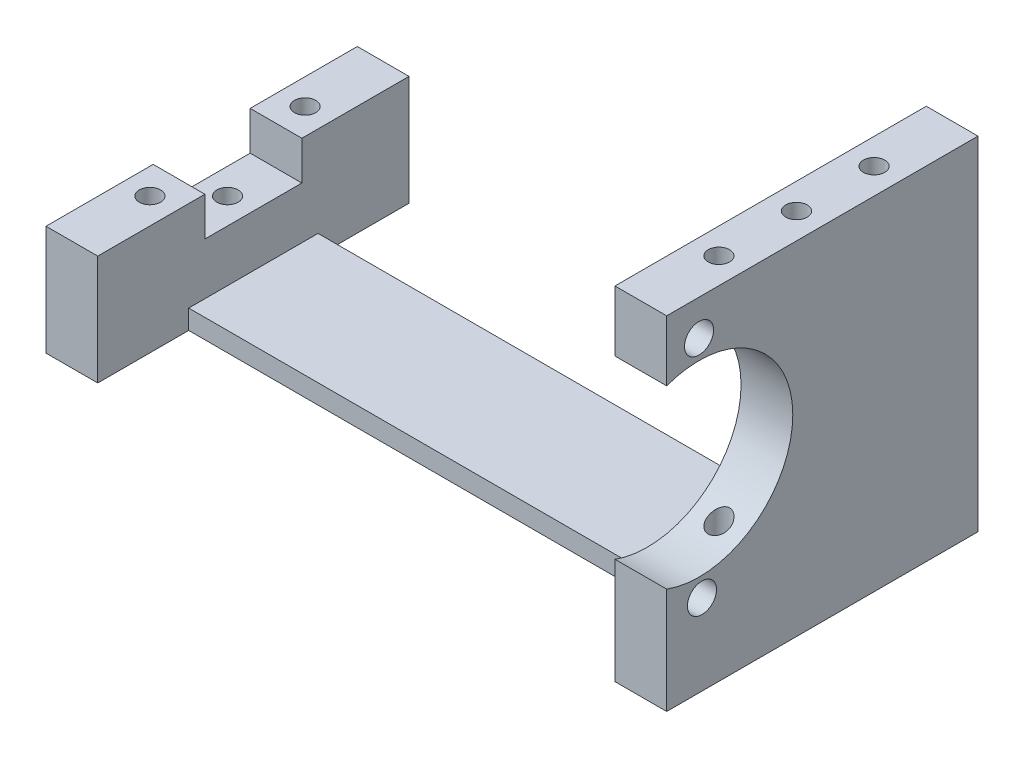
ISO-10303-21;
HEADER;
FILE_DESCRIPTION(('STEP AP214'),'2;1');
FILE_NAME('part.step','',(''),(''),'','','');
FILE_SCHEMA(('AUTOMOTIVE_DESIGN { 1 0 10303 214 1 1 1 1 }'));
ENDSEC;
DATA;
#1=APPLICATION_CONTEXT('core data for automotive mechanical design processes');
#2=APPLICATION_PROTOCOL_DEFINITION('international standard','automotive_design',2000,#1);
#3=PRODUCT_CONTEXT('',#1,'mechanical');
#4=PRODUCT('Part','Part','',(#3));
#5=PRODUCT_RELATED_PRODUCT_CATEGORY('part','',(#4));
#6=PRODUCT_DEFINITION_FORMATION('','',#4);
#7=PRODUCT_DEFINITION_CONTEXT('part definition',#1,'design');
#8=PRODUCT_DEFINITION('design','',#6,#7);
#9=PRODUCT_DEFINITION_SHAPE('','',#8);
#10=(LENGTH_UNIT() NAMED_UNIT(*) SI_UNIT(.MILLI.,.METRE.));
#11=(NAMED_UNIT(*) PLANE_ANGLE_UNIT() SI_UNIT($,.RADIAN.));
#12=(NAMED_UNIT(*) SI_UNIT($,.STERADIAN.) SOLID_ANGLE_UNIT());
#13=UNCERTAINTY_MEASURE_WITH_UNIT(LENGTH_MEASURE(1.E-05),#10,'distance_accuracy_value','');
#14=(GEOMETRIC_REPRESENTATION_CONTEXT(3) GLOBAL_UNCERTAINTY_ASSIGNED_CONTEXT((#13)) GLOBAL_UNIT_ASSIGNED_CONTEXT((#10,
#11,#12)) REPRESENTATION_CONTEXT('',''));
#15=CARTESIAN_POINT('',(0.,0.,0.));
#16=DIRECTION('',(0.,0.,1.));
#17=DIRECTION('',(1.,0.,0.));
#18=AXIS2_PLACEMENT_3D('',#15,#16,#17);
#19=CARTESIAN_POINT('',(-33.,17.,-24.0737419650709));
#20=DIRECTION('',(0.,-1.,0.));
#21=DIRECTION('',(0.,0.,-1.));
#22=AXIS2_PLACEMENT_3D('',#19,#20,#21);
#23=PLANE('',#22);
#24=CARTESIAN_POINT('',(-44.,17.,12.));
#25=DIRECTION('',(0.,-1.,0.));
#26=DIRECTION('',(0.,0.,-1.));
#27=AXIS2_PLACEMENT_3D('',#24,#25,#26);
#28=CIRCLE('',#27,1.65);
#29=CARTESIAN_POINT('',(-44.,17.,10.35));
#30=VERTEX_POINT('',#29);
#31=EDGE_CURVE('E216',#30,#30,#28,.T.);
#32=ORIENTED_EDGE('',*,*,#31,.T.);
#33=EDGE_LOOP('',(#32));
#34=FACE_BOUND('',#33,.T.);
#35=DIRECTION('',(0.,0.,1.));
#36=VECTOR('',#35,1.);
#37=CARTESIAN_POINT('',(-40.,17.,24.0737419650709));
#38=LINE('',#37,#36);
#39=CARTESIAN_POINT('',(-40.,17.,7.5));
#40=VERTEX_POINT('',#39);
#41=CARTESIAN_POINT('',(-40.,17.,24.0737419650709));
#42=VERTEX_POINT('',#41);
#43=EDGE_CURVE('E220',#40,#42,#38,.T.);
#44=ORIENTED_EDGE('',*,*,#43,.F.);
#45=DIRECTION('',(1.,0.,0.));
#46=VECTOR('',#45,1.);
#47=CARTESIAN_POINT('',(-48.,17.,7.5));
#48=LINE('',#47,#46);
#49=CARTESIAN_POINT('',(-48.,17.,7.5));
#50=VERTEX_POINT('',#49);
#51=EDGE_CURVE('E191',#50,#40,#48,.T.);
#52=ORIENTED_EDGE('',*,*,#51,.F.);
#53=DIRECTION('',(0.,0.,1.));
#54=VECTOR('',#53,1.);
#55=CARTESIAN_POINT('',(-48.,17.,-24.0737419650709));
#56=LINE('',#55,#54);
#57=CARTESIAN_POINT('',(-48.,17.,24.0737419650709));
#58=VERTEX_POINT('',#57);
#59=EDGE_CURVE('E71',#50,#58,#56,.T.);
#60=ORIENTED_EDGE('',*,*,#59,.T.);
#61=DIRECTION('',(-1.,0.,0.));
#62=VECTOR('',#61,1.);
#63=CARTESIAN_POINT('',(-33.,17.,24.0737419650709));
#64=LINE('',#63,#62);
#65=EDGE_CURVE('E210',#42,#58,#64,.T.);
#66=ORIENTED_EDGE('',*,*,#65,.F.);
#67=EDGE_LOOP('',(#44,#52,#60,#66));
#68=FACE_BOUND('',#67,.T.);
#69=ADVANCED_FACE('F45',(#34,#68),#23,.F.);
#70=CARTESIAN_POINT('',(48.,53.,24.0737419650709));
#71=DIRECTION('',(0.,0.,-1.));
#72=DIRECTION('',(-1.,0.,0.));
#73=AXIS2_PLACEMENT_3D('',#70,#71,#72);
#74=PLANE('',#73);
#75=DIRECTION('',(0.,-1.,0.));
#76=VECTOR('',#75,1.);
#77=CARTESIAN_POINT('',(40.,53.,24.0737419650709));
#78=LINE('',#77,#76);
#79=CARTESIAN_POINT('',(40.,53.,24.0737419650709));
#80=VERTEX_POINT('',#79);
#81=CARTESIAN_POINT('',(40.,43.6106575888162,24.0737419650709));
#82=VERTEX_POINT('',#81);
#83=EDGE_CURVE('E265',#80,#82,#78,.T.);
#84=ORIENTED_EDGE('',*,*,#83,.T.);
#85=DIRECTION('',(1.,0.,0.));
#86=VECTOR('',#85,1.);
#87=CARTESIAN_POINT('',(28.,43.6106575888162,24.0737419650709));
#88=LINE('',#87,#86);
#89=CARTESIAN_POINT('',(48.,43.6106575888162,24.0737419650709));
#90=VERTEX_POINT('',#89);
#91=EDGE_CURVE('E244',#82,#90,#88,.T.);
#92=ORIENTED_EDGE('',*,*,#91,.T.);
#93=DIRECTION('',(0.,-1.,0.));
#94=VECTOR('',#93,1.);
#95=CARTESIAN_POINT('',(48.,53.,24.0737419650709));
#96=LINE('',#95,#94);
#97=CARTESIAN_POINT('',(48.,53.,24.0737419650709));
#98=VERTEX_POINT('',#97);
#99=EDGE_CURVE('E270',#98,#90,#96,.T.);
#100=ORIENTED_EDGE('',*,*,#99,.F.);
#101=DIRECTION('',(1.,0.,0.));
#102=VECTOR('',#101,1.);
#103=CARTESIAN_POINT('',(48.,53.,24.0737419650709));
#104=LINE('',#103,#102);
#105=EDGE_CURVE('E274',#80,#98,#104,.T.);
#106=ORIENTED_EDGE('',*,*,#105,.F.);
#107=EDGE_LOOP('',(#84,#92,#100,#106));
#108=FACE_BOUND('',#107,.T.);
#109=ADVANCED_FACE('F448',(#108),#74,.F.);
#110=CARTESIAN_POINT('',(44.,53.,12.));
#111=DIRECTION('',(0.,-1.,0.));
#112=DIRECTION('',(0.,0.,-1.));
#113=AXIS2_PLACEMENT_3D('',#110,#111,#112);
#114=CYLINDRICAL_SURFACE('',#113,1.65);
#115=CARTESIAN_POINT('',(44.,41.5821555043464,10.35));
#116=CARTESIAN_POINT('',(43.9199288509002,41.5821591037592,10.3500039617206));
#117=CARTESIAN_POINT('',(43.8398245615708,41.5865818513109,10.3558672053447));
#118=CARTESIAN_POINT('',(43.6821931853622,41.6038995568564,10.378932496376));
#119=CARTESIAN_POINT('',(43.6046682651438,41.6168014575037,10.3961438355382));
#120=CARTESIAN_POINT('',(43.4547621394242,41.6499771597757,10.4407360356112));
#121=CARTESIAN_POINT('',(43.3823569729022,41.6702134690484,10.4680651908158));
#122=CARTESIAN_POINT('',(43.2436848216434,41.7167700606641,10.5315616901544));
#123=CARTESIAN_POINT('',(43.1774193393808,41.7430918267318,10.5677311898188));
#124=CARTESIAN_POINT('',(43.0466313563389,41.8029009506185,10.6508945479393));
#125=CARTESIAN_POINT('',(42.9827161555722,41.836803057512,10.6985399610094));
#126=CARTESIAN_POINT('',(42.8636468445302,41.9087012724993,10.8010905303718));
#127=CARTESIAN_POINT('',(42.8084968133335,41.9466992729897,10.8559990450678));
#128=CARTESIAN_POINT('',(42.6974525985209,42.0331557406787,10.9829984187664));
#129=CARTESIAN_POINT('',(42.6434765781885,42.0822161508543,11.0563587120478));
#130=CARTESIAN_POINT('',(42.5487391332816,42.1826187055074,11.209759111189));
#131=CARTESIAN_POINT('',(42.5079872293476,42.2339624637659,11.289803977677));
#132=CARTESIAN_POINT('',(42.4349427737334,42.3452967766474,11.4674160691214));
#133=CARTESIAN_POINT('',(42.4048464984389,42.4054256913103,11.565807340113));
#134=CARTESIAN_POINT('',(42.3633177867184,42.524943694102,11.7669311545793));
#135=CARTESIAN_POINT('',(42.3518931036914,42.5843324647321,11.8696654833572));
#136=CARTESIAN_POINT('',(42.3484701676112,42.7031283021795,12.0811867829405));
#137=CARTESIAN_POINT('',(42.3573001531811,42.7624332750226,12.1900477155448));
#138=CARTESIAN_POINT('',(42.3969950559538,42.8766282533895,12.4061069826035));
#139=CARTESIAN_POINT('',(42.4278522803289,42.9315197928232,12.5133058841576));
#140=CARTESIAN_POINT('',(42.5091057602564,43.0316349606433,12.7146325684817));
#141=CARTESIAN_POINT('',(42.5580220444466,43.0772629820503,12.8091529372128));
#142=CARTESIAN_POINT('',(42.674891143368,43.161890525777,12.9889656966792));
#143=CARTESIAN_POINT('',(42.7428277285592,43.200895653859,13.0742658691397));
#144=CARTESIAN_POINT('',(42.887417354187,43.2671390825486,13.2223436406445));
#145=CARTESIAN_POINT('',(42.9621952826798,43.2952117164162,13.2865800652606));
#146=CARTESIAN_POINT('',(43.1235115563741,43.3446234032587,13.4014455521741));
#147=CARTESIAN_POINT('',(43.2100420730979,43.3659669073835,13.4520836061506));
#148=CARTESIAN_POINT('',(43.3833563760174,43.3997568471184,13.5331402939909));
#149=CARTESIAN_POINT('',(43.469328525804,43.4128577969983,13.5650269617582));
#150=CARTESIAN_POINT('',(43.6460309717697,43.4329442518195,13.6141885372001));
#151=CARTESIAN_POINT('',(43.7367594903427,43.4399320244215,13.6314688629631));
#152=CARTESIAN_POINT('',(43.9152012615458,43.4474729296546,13.6501301332032));
#153=CARTESIAN_POINT('',(44.0028187453818,43.4483480907855,13.6523067393003));
#154=CARTESIAN_POINT('',(44.177164283298,43.4445042401245,13.6427814401379));
#155=CARTESIAN_POINT('',(44.2638924586303,43.4397860014702,13.6310814529455));
#156=CARTESIAN_POINT('',(44.4328120975353,43.4249272801768,13.5945353955563));
#157=CARTESIAN_POINT('',(44.515048735841,43.4148601918147,13.5698673144668));
#158=CARTESIAN_POINT('',(44.6740145950646,43.389502836156,13.508464765609));
#159=CARTESIAN_POINT('',(44.750743595424,43.3742123598249,13.4717298149396));
#160=CARTESIAN_POINT('',(44.8983854040077,43.3382621325459,13.3866572926753));
#161=CARTESIAN_POINT('',(44.9691369510929,43.3174936254812,13.3380864270719));
#162=CARTESIAN_POINT('',(45.1013531857602,43.2711058853598,13.2315576329533));
#163=CARTESIAN_POINT('',(45.162816103598,43.2454857300179,13.1735979199468));
#164=CARTESIAN_POINT('',(45.2784813608872,43.1882845041474,13.0467822513979));
#165=CARTESIAN_POINT('',(45.3320901051967,43.1564512292803,12.9774996697509));
#166=CARTESIAN_POINT('',(45.4269813052059,43.0884759375528,12.8328939222301));
#167=CARTESIAN_POINT('',(45.4682597271223,43.0523325160553,12.7575687897766));
#168=CARTESIAN_POINT('',(45.5412561630048,42.973089573905,12.5962659732721));
#169=CARTESIAN_POINT('',(45.5718254004219,42.9296582623291,12.5099323303297));
#170=CARTESIAN_POINT('',(45.6181459188124,42.8394091290781,12.3351019836301));
#171=CARTESIAN_POINT('',(45.6338907038217,42.7925898324808,12.2466043490382));
#172=CARTESIAN_POINT('',(45.6518319006975,42.6914261743578,12.0601773554621));
#173=CARTESIAN_POINT('',(45.6524192398346,42.636809656593,11.9622404078026));
#174=CARTESIAN_POINT('',(45.6365939094891,42.5259267293846,11.7687010245985));
#175=CARTESIAN_POINT('',(45.6201740223053,42.469659629301,11.6730995978577));
#176=CARTESIAN_POINT('',(45.568801243886,42.3519179130047,11.4780721884206));
#177=CARTESIAN_POINT('',(45.5323413446849,42.2904217487518,11.3790526957922));
#178=CARTESIAN_POINT('',(45.4406653293609,42.1691995379669,11.18873526345));
#179=CARTESIAN_POINT('',(45.3854316091819,42.1094752102312,11.0974446717867));
#180=CARTESIAN_POINT('',(45.2563233201627,41.994047260416,10.92489724634));
#181=CARTESIAN_POINT('',(45.1823313176925,41.9383719224782,10.8437086143974));
#182=CARTESIAN_POINT('',(45.0166126371388,41.83495173611,10.6956724055473));
#183=CARTESIAN_POINT('',(44.9249292716247,41.7871880383275,10.6287906285736));
#184=CARTESIAN_POINT('',(44.7579614457744,41.7173621308838,10.5323274987627));
#185=CARTESIAN_POINT('',(44.6869649250694,41.6919838398751,10.4976785249755));
#186=CARTESIAN_POINT('',(44.5388879671805,41.648311315065,10.4384538570868));
#187=CARTESIAN_POINT('',(44.4618182882165,41.6300048790762,10.4138608075846));
#188=CARTESIAN_POINT('',(44.3206492995395,41.6048547686074,10.3801991606782));
#189=CARTESIAN_POINT('',(44.2573590957031,41.5963866465049,10.3689211153159));
#190=CARTESIAN_POINT('',(44.1293865349191,41.5850353784308,10.3538196918406));
#191=CARTESIAN_POINT('',(44.064704087698,41.5821525957242,10.3499967986032));
#192=CARTESIAN_POINT('',(44.,41.5821555043464,10.35));
#193=B_SPLINE_CURVE_WITH_KNOTS('',3,(#115,#116,#117,#118,#119,#120,#121,#122,#123,#124,#125,
#126,#127,#128,#129,#130,#131,#132,#133,#134,#135,#136,#137,#138,#139,#140,#141,#142,#143,#144,
#145,#146,#147,#148,#149,#150,#151,#152,#153,#154,#155,#156,#157,#158,#159,#160,#161,#162,#163,
#164,#165,#166,#167,#168,#169,#170,#171,#172,#173,#174,#175,#176,#177,#178,#179,#180,#181,#182,
#183,#184,#185,#186,#187,#188,#189,#190,#191,#192),.UNSPECIFIED.,.T.,.F.,(4,2,2,2,2,2,2,2,2,2,2,
2,2,2,2,2,2,2,2,2,2,2,2,2,2,2,2,2,2,2,2,2,2,2,2,2,2,2,4),(0.,0.239948002160773,
0.480092716747698,0.719026774112203,0.95801914869586,1.21696256397352,1.47602613404552,
1.78518347305687,2.09456289716383,2.45050546298702,2.80659579682894,3.17750522099601,
3.54828517150555,3.8937172840234,4.23885554172016,4.54466897026626,4.85027968444335,
5.12673611324901,5.4030899480189,5.66476687403392,5.92640763444414,6.18454764277121,
6.44269798279803,6.70641963968612,6.97019147976925,7.24862721848503,7.52715394610395,
7.82998871635141,8.13295612485416,8.46796695626159,8.80312002127732,9.16783639988999,
9.53289571783669,9.90029944781493,10.2668148460786,10.5147786116641,10.7623125945601,
10.9561977464281,11.150095507973),.UNSPECIFIED.);
#194=CARTESIAN_POINT('',(44.,41.5821555043464,10.35));
#195=VERTEX_POINT('',#194);
#196=EDGE_CURVE('E240',#195,#195,#193,.T.);
#197=ORIENTED_EDGE('',*,*,#196,.F.);
#198=EDGE_LOOP('',(#197));
#199=FACE_BOUND('',#198,.T.);
#200=CARTESIAN_POINT('',(44.,53.,12.));
#201=DIRECTION('',(0.,1.,0.));
#202=DIRECTION('',(0.,0.,-1.));
#203=AXIS2_PLACEMENT_3D('',#200,#201,#202);
#204=CIRCLE('',#203,1.65);
#205=CARTESIAN_POINT('',(44.,53.,10.35));
#206=VERTEX_POINT('',#205);
#207=EDGE_CURVE('E308',#206,#206,#204,.T.);
#208=ORIENTED_EDGE('',*,*,#207,.T.);
#209=EDGE_LOOP('',(#208));
#210=FACE_BOUND('',#209,.T.);
#211=ADVANCED_FACE('F458',(#199,#210),#114,.F.);
#212=CARTESIAN_POINT('',(-40.,53.,24.0737419650709));
#213=DIRECTION('',(-1.,0.,0.));
#214=DIRECTION('',(0.,0.,1.));
#215=AXIS2_PLACEMENT_3D('',#212,#213,#214);
#216=PLANE('',#215);
#217=DIRECTION('',(0.,0.,-1.));
#218=VECTOR('',#217,1.);
#219=CARTESIAN_POINT('',(-40.,11.,7.5));
#220=LINE('',#219,#218);
#221=CARTESIAN_POINT('',(-40.,11.,7.5));
#222=VERTEX_POINT('',#221);
#223=CARTESIAN_POINT('',(-40.,11.,-7.5));
#224=VERTEX_POINT('',#223);
#225=EDGE_CURVE('E181',#222,#224,#220,.T.);
#226=ORIENTED_EDGE('',*,*,#225,.F.);
#227=DIRECTION('',(0.,1.,0.));
#228=VECTOR('',#227,1.);
#229=CARTESIAN_POINT('',(-40.,11.,7.5));
#230=LINE('',#229,#228);
#231=EDGE_CURVE('E514',#222,#40,#230,.T.);
#232=ORIENTED_EDGE('',*,*,#231,.T.);
#233=ORIENTED_EDGE('',*,*,#43,.T.);
#234=DIRECTION('',(0.,-1.,0.));
#235=VECTOR('',#234,1.);
#236=CARTESIAN_POINT('',(-40.,53.,24.0737419650709));
#237=LINE('',#236,#235);
#238=CARTESIAN_POINT('',(-40.,0.,24.0737419650709));
#239=VERTEX_POINT('',#238);
#240=EDGE_CURVE('E395',#42,#239,#237,.T.);
#241=ORIENTED_EDGE('',*,*,#240,.T.);
#242=DIRECTION('',(0.,0.,-1.));
#243=VECTOR('',#242,1.);
#244=CARTESIAN_POINT('',(-40.,0.,24.0737419650709));
#245=LINE('',#244,#243);
#246=CARTESIAN_POINT('',(-40.,0.,10.));
#247=VERTEX_POINT('',#246);
#248=EDGE_CURVE('E380',#239,#247,#245,.T.);
#249=ORIENTED_EDGE('',*,*,#248,.T.);
#250=DIRECTION('',(0.,-1.,0.));
#251=VECTOR('',#250,1.);
#252=CARTESIAN_POINT('',(-40.,3.,10.));
#253=LINE('',#252,#251);
#254=CARTESIAN_POINT('',(-40.,3.,10.));
#255=VERTEX_POINT('',#254);
#256=EDGE_CURVE('E334',#255,#247,#253,.T.);
#257=ORIENTED_EDGE('',*,*,#256,.F.);
#258=DIRECTION('',(0.,0.,1.));
#259=VECTOR('',#258,1.);
#260=CARTESIAN_POINT('',(-40.,3.,10.));
#261=LINE('',#260,#259);
#262=CARTESIAN_POINT('',(-40.,3.,-10.));
#263=VERTEX_POINT('',#262);
#264=EDGE_CURVE('E340',#263,#255,#261,.T.);
#265=ORIENTED_EDGE('',*,*,#264,.F.);
#266=DIRECTION('',(0.,1.,0.));
#267=VECTOR('',#266,1.);
#268=CARTESIAN_POINT('',(-40.,3.,-10.));
#269=LINE('',#268,#267);
#270=CARTESIAN_POINT('',(-40.,0.,-10.));
#271=VERTEX_POINT('',#270);
#272=EDGE_CURVE('E328',#271,#263,#269,.T.);
#273=ORIENTED_EDGE('',*,*,#272,.F.);
#274=CARTESIAN_POINT('',(-40.,0.,-24.0737419650709));
#275=VERTEX_POINT('',#274);
#276=EDGE_CURVE('E379',#271,#275,#245,.T.);
#277=ORIENTED_EDGE('',*,*,#276,.T.);
#278=DIRECTION('',(0.,-1.,0.));
#279=VECTOR('',#278,1.);
#280=CARTESIAN_POINT('',(-40.,53.,-24.0737419650709));
#281=LINE('',#280,#279);
#282=CARTESIAN_POINT('',(-40.,17.,-24.0737419650709));
#283=VERTEX_POINT('',#282);
#284=EDGE_CURVE('E11',#283,#275,#281,.T.);
#285=ORIENTED_EDGE('',*,*,#284,.F.);
#286=CARTESIAN_POINT('',(-40.,17.,-7.5));
#287=VERTEX_POINT('',#286);
#288=EDGE_CURVE('E195',#283,#287,#38,.T.);
#289=ORIENTED_EDGE('',*,*,#288,.T.);
#290=DIRECTION('',(0.,1.,0.));
#291=VECTOR('',#290,1.);
#292=CARTESIAN_POINT('',(-40.,11.,-7.5));
#293=LINE('',#292,#291);
#294=EDGE_CURVE('E63',#224,#287,#293,.T.);
#295=ORIENTED_EDGE('',*,*,#294,.F.);
#296=EDGE_LOOP('',(#226,#232,#233,#241,#249,#257,#265,#273,#277,#285,#289,#295));
#297=FACE_BOUND('',#296,.T.);
#298=ADVANCED_FACE('F47',(#297),#216,.F.);
#299=CARTESIAN_POINT('',(0.,0.,0.));
#300=DIRECTION('',(0.,-1.,0.));
#301=DIRECTION('',(0.,0.,-1.));
#302=AXIS2_PLACEMENT_3D('',#299,#300,#301);
#303=PLANE('',#302);
#304=CARTESIAN_POINT('',(-44.,0.,12.));
#305=DIRECTION('',(0.,1.,0.));
#306=DIRECTION('',(0.,0.,1.));
#307=AXIS2_PLACEMENT_3D('',#304,#305,#306);
#308=CIRCLE('',#307,1.65);
#309=CARTESIAN_POINT('',(-44.,0.,13.65));
#310=VERTEX_POINT('',#309);
#311=EDGE_CURVE('E371',#310,#310,#308,.T.);
#312=ORIENTED_EDGE('',*,*,#311,.T.);
#313=EDGE_LOOP('',(#312));
#314=FACE_BOUND('',#313,.T.);
#315=ORIENTED_EDGE('',*,*,#248,.F.);
#316=DIRECTION('',(1.,0.,0.));
#317=VECTOR('',#316,1.);
#318=CARTESIAN_POINT('',(-48.,0.,24.0737419650709));
#319=LINE('',#318,#317);
#320=CARTESIAN_POINT('',(-48.,0.,24.0737419650709));
#321=VERTEX_POINT('',#320);
#322=EDGE_CURVE('E391',#321,#239,#319,.T.);
#323=ORIENTED_EDGE('',*,*,#322,.F.);
#324=DIRECTION('',(0.,0.,1.));
#325=VECTOR('',#324,1.);
#326=CARTESIAN_POINT('',(-48.,0.,24.0737419650709));
#327=LINE('',#326,#325);
#328=CARTESIAN_POINT('',(-48.,0.,-24.0737419650709));
#329=VERTEX_POINT('',#328);
#330=EDGE_CURVE('E387',#329,#321,#327,.T.);
#331=ORIENTED_EDGE('',*,*,#330,.F.);
#332=DIRECTION('',(-1.,0.,0.));
#333=VECTOR('',#332,1.);
#334=CARTESIAN_POINT('',(-48.,0.,-24.0737419650709));
#335=LINE('',#334,#333);
#336=EDGE_CURVE('E383',#275,#329,#335,.T.);
#337=ORIENTED_EDGE('',*,*,#336,.F.);
#338=ORIENTED_EDGE('',*,*,#276,.F.);
#339=DIRECTION('',(-1.,0.,0.));
#340=VECTOR('',#339,1.);
#341=CARTESIAN_POINT('',(60.2237484161567,0.,-10.));
#342=LINE('',#341,#340);
#343=CARTESIAN_POINT('',(40.,0.,-10.));
#344=VERTEX_POINT('',#343);
#345=EDGE_CURVE('E333',#344,#271,#342,.T.);
#346=ORIENTED_EDGE('',*,*,#345,.F.);
#347=DIRECTION('',(0.,0.,1.));
#348=VECTOR('',#347,1.);
#349=CARTESIAN_POINT('',(40.,0.,24.0737419650709));
#350=LINE('',#349,#348);
#351=CARTESIAN_POINT('',(40.,0.,-24.0737419650709));
#352=VERTEX_POINT('',#351);
#353=EDGE_CURVE('E281',#352,#344,#350,.T.);
#354=ORIENTED_EDGE('',*,*,#353,.F.);
#355=DIRECTION('',(-1.,0.,0.));
#356=VECTOR('',#355,1.);
#357=CARTESIAN_POINT('',(48.,0.,-24.0737419650709));
#358=LINE('',#357,#356);
#359=CARTESIAN_POINT('',(48.,0.,-24.0737419650709));
#360=VERTEX_POINT('',#359);
#361=EDGE_CURVE('E285',#360,#352,#358,.T.);
#362=ORIENTED_EDGE('',*,*,#361,.F.);
#363=DIRECTION('',(0.,0.,-1.));
#364=VECTOR('',#363,1.);
#365=CARTESIAN_POINT('',(48.,0.,24.0737419650709));
#366=LINE('',#365,#364);
#367=CARTESIAN_POINT('',(48.,0.,24.0737419650709));
#368=VERTEX_POINT('',#367);
#369=EDGE_CURVE('E288',#368,#360,#366,.T.);
#370=ORIENTED_EDGE('',*,*,#369,.F.);
#371=DIRECTION('',(1.,0.,0.));
#372=VECTOR('',#371,1.);
#373=CARTESIAN_POINT('',(48.,0.,24.0737419650709));
#374=LINE('',#373,#372);
#375=CARTESIAN_POINT('',(40.,0.,24.0737419650709));
#376=VERTEX_POINT('',#375);
#377=EDGE_CURVE('E275',#376,#368,#374,.T.);
#378=ORIENTED_EDGE('',*,*,#377,.F.);
#379=CARTESIAN_POINT('',(40.,0.,9.99999999999999));
#380=VERTEX_POINT('',#379);
#381=EDGE_CURVE('E279',#380,#376,#350,.T.);
#382=ORIENTED_EDGE('',*,*,#381,.F.);
#383=DIRECTION('',(-1.,0.,0.));
#384=VECTOR('',#383,1.);
#385=CARTESIAN_POINT('',(60.2237484161567,0.,9.99999999999998));
#386=LINE('',#385,#384);
#387=EDGE_CURVE('E338',#380,#247,#386,.T.);
#388=ORIENTED_EDGE('',*,*,#387,.T.);
#389=EDGE_LOOP('',(#315,#323,#331,#337,#338,#346,#354,#362,#370,#378,#382,#388));
#390=FACE_BOUND('',#389,.T.);
#391=CARTESIAN_POINT('',(-44.,0.,0.));
#392=DIRECTION('',(0.,1.,0.));
#393=DIRECTION('',(0.,0.,1.));
#394=AXIS2_PLACEMENT_3D('',#391,#392,#393);
#395=CIRCLE('',#394,1.65);
#396=CARTESIAN_POINT('',(-44.,0.,1.65));
#397=VERTEX_POINT('',#396);
#398=EDGE_CURVE('E375',#397,#397,#395,.T.);
#399=ORIENTED_EDGE('',*,*,#398,.T.);
#400=EDGE_LOOP('',(#399));
#401=FACE_BOUND('',#400,.T.);
#402=CARTESIAN_POINT('',(-44.,0.,-12.));
#403=DIRECTION('',(0.,1.,0.));
#404=DIRECTION('',(0.,0.,-1.));
#405=AXIS2_PLACEMENT_3D('',#402,#403,#404);
#406=CIRCLE('',#405,1.65);
#407=CARTESIAN_POINT('',(-44.,0.,-13.65));
#408=VERTEX_POINT('',#407);
#409=EDGE_CURVE('E348',#408,#408,#406,.T.);
#410=ORIENTED_EDGE('',*,*,#409,.T.);
#411=EDGE_LOOP('',(#410));
#412=FACE_BOUND('',#411,.T.);
#413=CARTESIAN_POINT('',(44.,0.,0.));
#414=DIRECTION('',(0.,1.,0.));
#415=DIRECTION('',(0.,0.,-1.));
#416=AXIS2_PLACEMENT_3D('',#413,#414,#415);
#417=CIRCLE('',#416,1.65);
#418=CARTESIAN_POINT('',(44.,0.,-1.65));
#419=VERTEX_POINT('',#418);
#420=EDGE_CURVE('E304',#419,#419,#417,.T.);
#421=ORIENTED_EDGE('',*,*,#420,.T.);
#422=EDGE_LOOP('',(#421));
#423=FACE_BOUND('',#422,.T.);
#424=CARTESIAN_POINT('',(44.,0.,12.));
#425=DIRECTION('',(0.,1.,0.));
#426=DIRECTION('',(0.,0.,-1.));
#427=AXIS2_PLACEMENT_3D('',#424,#425,#426);
#428=CIRCLE('',#427,1.65);
#429=CARTESIAN_POINT('',(44.,0.,10.35));
#430=VERTEX_POINT('',#429);
#431=EDGE_CURVE('E312',#430,#430,#428,.T.);
#432=ORIENTED_EDGE('',*,*,#431,.T.);
#433=EDGE_LOOP('',(#432));
#434=FACE_BOUND('',#433,.T.);
#435=CARTESIAN_POINT('',(43.9999999999999,0.,-12.));
#436=DIRECTION('',(0.,1.,0.));
#437=DIRECTION('',(0.,0.,1.));
#438=AXIS2_PLACEMENT_3D('',#435,#436,#437);
#439=CIRCLE('',#438,1.65);
#440=CARTESIAN_POINT('',(43.9999999999999,0.,-10.35));
#441=VERTEX_POINT('',#440);
#442=EDGE_CURVE('E320',#441,#441,#439,.T.);
#443=ORIENTED_EDGE('',*,*,#442,.T.);
#444=EDGE_LOOP('',(#443));
#445=FACE_BOUND('',#444,.T.);
#446=ADVANCED_FACE('F500',(#314,#390,#401,#412,#423,#434,#445),#303,.T.);
#447=CARTESIAN_POINT('',(-48.,53.,-24.0737419650709));
#448=DIRECTION('',(0.,0.,1.));
#449=DIRECTION('',(1.,0.,0.));
#450=AXIS2_PLACEMENT_3D('',#447,#448,#449);
#451=PLANE('',#450);
#452=DIRECTION('',(0.,-1.,0.));
#453=VECTOR('',#452,1.);
#454=CARTESIAN_POINT('',(-48.,53.,-24.0737419650709));
#455=LINE('',#454,#453);
#456=CARTESIAN_POINT('',(-48.,17.,-24.0737419650709));
#457=VERTEX_POINT('',#456);
#458=EDGE_CURVE('E55',#457,#329,#455,.T.);
#459=ORIENTED_EDGE('',*,*,#458,.F.);
#460=DIRECTION('',(-1.,0.,0.));
#461=VECTOR('',#460,1.);
#462=CARTESIAN_POINT('',(-33.,17.,-24.0737419650709));
#463=LINE('',#462,#461);
#464=EDGE_CURVE('E209',#283,#457,#463,.T.);
#465=ORIENTED_EDGE('',*,*,#464,.F.);
#466=ORIENTED_EDGE('',*,*,#284,.T.);
#467=ORIENTED_EDGE('',*,*,#336,.T.);
#468=EDGE_LOOP('',(#459,#465,#466,#467));
#469=FACE_BOUND('',#468,.T.);
#470=ADVANCED_FACE('F492',(#469),#451,.F.);
#471=CARTESIAN_POINT('',(-48.,53.,24.0737419650709));
#472=DIRECTION('',(1.,0.,0.));
#473=DIRECTION('',(0.,0.,-1.));
#474=AXIS2_PLACEMENT_3D('',#471,#472,#473);
#475=PLANE('',#474);
#476=ORIENTED_EDGE('',*,*,#59,.F.);
#477=DIRECTION('',(0.,1.,0.));
#478=VECTOR('',#477,1.);
#479=CARTESIAN_POINT('',(-48.,11.,7.5));
#480=LINE('',#479,#478);
#481=CARTESIAN_POINT('',(-48.,11.,7.5));
#482=VERTEX_POINT('',#481);
#483=EDGE_CURVE('E200',#482,#50,#480,.T.);
#484=ORIENTED_EDGE('',*,*,#483,.F.);
#485=DIRECTION('',(0.,0.,1.));
#486=VECTOR('',#485,1.);
#487=CARTESIAN_POINT('',(-48.,11.,7.5));
#488=LINE('',#487,#486);
#489=CARTESIAN_POINT('',(-48.,11.,-7.5));
#490=VERTEX_POINT('',#489);
#491=EDGE_CURVE('E180',#490,#482,#488,.T.);
#492=ORIENTED_EDGE('',*,*,#491,.F.);
#493=DIRECTION('',(0.,1.,0.));
#494=VECTOR('',#493,1.);
#495=CARTESIAN_POINT('',(-48.,11.,-7.5));
#496=LINE('',#495,#494);
#497=CARTESIAN_POINT('',(-48.,17.,-7.5));
#498=VERTEX_POINT('',#497);
#499=EDGE_CURVE('E176',#490,#498,#496,.T.);
#500=ORIENTED_EDGE('',*,*,#499,.T.);
#501=EDGE_CURVE('E205',#457,#498,#56,.T.);
#502=ORIENTED_EDGE('',*,*,#501,.F.);
#503=ORIENTED_EDGE('',*,*,#458,.T.);
#504=ORIENTED_EDGE('',*,*,#330,.T.);
#505=DIRECTION('',(0.,-1.,0.));
#506=VECTOR('',#505,1.);
#507=CARTESIAN_POINT('',(-48.,53.,24.0737419650709));
#508=LINE('',#507,#506);
#509=EDGE_CURVE('E398',#58,#321,#508,.T.);
#510=ORIENTED_EDGE('',*,*,#509,.F.);
#511=EDGE_LOOP('',(#476,#484,#492,#500,#502,#503,#504,#510));
#512=FACE_BOUND('',#511,.T.);
#513=ADVANCED_FACE('F490',(#512),#475,.F.);
#514=CARTESIAN_POINT('',(-48.,53.,24.0737419650709));
#515=DIRECTION('',(0.,0.,-1.));
#516=DIRECTION('',(-1.,0.,0.));
#517=AXIS2_PLACEMENT_3D('',#514,#515,#516);
#518=PLANE('',#517);
#519=ORIENTED_EDGE('',*,*,#240,.F.);
#520=ORIENTED_EDGE('',*,*,#65,.T.);
#521=ORIENTED_EDGE('',*,*,#509,.T.);
#522=ORIENTED_EDGE('',*,*,#322,.T.);
#523=EDGE_LOOP('',(#519,#520,#521,#522));
#524=FACE_BOUND('',#523,.T.);
#525=ADVANCED_FACE('F506',(#524),#518,.F.);
#526=CARTESIAN_POINT('',(-44.,53.,0.));
#527=DIRECTION('',(0.,-1.,0.));
#528=DIRECTION('',(0.,0.,-1.));
#529=AXIS2_PLACEMENT_3D('',#526,#527,#528);
#530=CYLINDRICAL_SURFACE('',#529,1.65);
#531=CARTESIAN_POINT('',(-44.,11.,0.));
#532=DIRECTION('',(0.,-1.,0.));
#533=DIRECTION('',(0.,0.,-1.));
#534=AXIS2_PLACEMENT_3D('',#531,#532,#533);
#535=CIRCLE('',#534,1.65);
#536=CARTESIAN_POINT('',(-44.,11.,-1.65));
#537=VERTEX_POINT('',#536);
#538=EDGE_CURVE('E49',#537,#537,#535,.T.);
#539=ORIENTED_EDGE('',*,*,#538,.F.);
#540=EDGE_LOOP('',(#539));
#541=FACE_BOUND('',#540,.T.);
#542=ORIENTED_EDGE('',*,*,#398,.F.);
#543=EDGE_LOOP('',(#542));
#544=FACE_BOUND('',#543,.T.);
#545=ADVANCED_FACE('F526',(#541,#544),#530,.F.);
#546=CARTESIAN_POINT('',(-44.,53.,12.));
#547=DIRECTION('',(0.,-1.,0.));
#548=DIRECTION('',(0.,0.,-1.));
#549=AXIS2_PLACEMENT_3D('',#546,#547,#548);
#550=CYLINDRICAL_SURFACE('',#549,1.65);
#551=ORIENTED_EDGE('',*,*,#31,.F.);
#552=EDGE_LOOP('',(#551));
#553=FACE_BOUND('',#552,.T.);
#554=ORIENTED_EDGE('',*,*,#311,.F.);
#555=EDGE_LOOP('',(#554));
#556=FACE_BOUND('',#555,.T.);
#557=ADVANCED_FACE('F528',(#553,#556),#550,.F.);
#558=CARTESIAN_POINT('',(-44.,53.,-12.));
#559=DIRECTION('',(0.,-1.,0.));
#560=DIRECTION('',(0.,0.,-1.));
#561=AXIS2_PLACEMENT_3D('',#558,#559,#560);
#562=CYLINDRICAL_SURFACE('',#561,1.65);
#563=CARTESIAN_POINT('',(-44.,17.,-12.));
#564=DIRECTION('',(0.,-1.,0.));
#565=DIRECTION('',(0.,0.,-1.));
#566=AXIS2_PLACEMENT_3D('',#563,#564,#565);
#567=CIRCLE('',#566,1.65);
#568=CARTESIAN_POINT('',(-44.,17.,-13.65));
#569=VERTEX_POINT('',#568);
#570=EDGE_CURVE('E213',#569,#569,#567,.T.);
#571=ORIENTED_EDGE('',*,*,#570,.F.);
#572=EDGE_LOOP('',(#571));
#573=FACE_BOUND('',#572,.T.);
#574=ORIENTED_EDGE('',*,*,#409,.F.);
#575=EDGE_LOOP('',(#574));
#576=FACE_BOUND('',#575,.T.);
#577=ADVANCED_FACE('F557',(#573,#576),#562,.F.);
#578=CARTESIAN_POINT('',(60.2237484161567,3.,9.99999999999998));
#579=DIRECTION('',(0.,-1.,0.));
#580=DIRECTION('',(0.,0.,-1.));
#581=AXIS2_PLACEMENT_3D('',#578,#579,#580);
#582=PLANE('',#581);
#583=DIRECTION('',(0.,0.,1.));
#584=VECTOR('',#583,1.);
#585=CARTESIAN_POINT('',(40.,3.,9.99999999999998));
#586=LINE('',#585,#584);
#587=CARTESIAN_POINT('',(40.,3.,-10.));
#588=VERTEX_POINT('',#587);
#589=CARTESIAN_POINT('',(40.,3.,9.99999999999999));
#590=VERTEX_POINT('',#589);
#591=EDGE_CURVE('E349',#588,#590,#586,.T.);
#592=ORIENTED_EDGE('',*,*,#591,.F.);
#593=DIRECTION('',(-1.,0.,0.));
#594=VECTOR('',#593,1.);
#595=CARTESIAN_POINT('',(60.2237484161567,3.,-10.));
#596=LINE('',#595,#594);
#597=EDGE_CURVE('E324',#588,#263,#596,.T.);
#598=ORIENTED_EDGE('',*,*,#597,.T.);
#599=ORIENTED_EDGE('',*,*,#264,.T.);
#600=DIRECTION('',(-1.,0.,0.));
#601=VECTOR('',#600,1.);
#602=CARTESIAN_POINT('',(60.2237484161567,3.,9.99999999999998));
#603=LINE('',#602,#601);
#604=EDGE_CURVE('E339',#590,#255,#603,.T.);
#605=ORIENTED_EDGE('',*,*,#604,.F.);
#606=EDGE_LOOP('',(#592,#598,#599,#605));
#607=FACE_BOUND('',#606,.T.);
#608=ADVANCED_FACE('F553',(#607),#582,.F.);
#609=CARTESIAN_POINT('',(60.2237484161567,3.,9.99999999999998));
#610=DIRECTION('',(0.,0.,-1.));
#611=DIRECTION('',(-1.,0.,0.));
#612=AXIS2_PLACEMENT_3D('',#609,#610,#611);
#613=PLANE('',#612);
#614=DIRECTION('',(0.,-1.,0.));
#615=VECTOR('',#614,1.);
#616=CARTESIAN_POINT('',(40.,3.,9.99999999999999));
#617=LINE('',#616,#615);
#618=EDGE_CURVE('E344',#590,#380,#617,.T.);
#619=ORIENTED_EDGE('',*,*,#618,.F.);
#620=ORIENTED_EDGE('',*,*,#604,.T.);
#621=ORIENTED_EDGE('',*,*,#256,.T.);
#622=ORIENTED_EDGE('',*,*,#387,.F.);
#623=EDGE_LOOP('',(#619,#620,#621,#622));
#624=FACE_BOUND('',#623,.T.);
#625=ADVANCED_FACE('F549',(#624),#613,.F.);
#626=CARTESIAN_POINT('',(60.2237484161567,3.,-10.));
#627=DIRECTION('',(0.,0.,1.));
#628=DIRECTION('',(0.,-1.,0.));
#629=AXIS2_PLACEMENT_3D('',#626,#627,#628);
#630=PLANE('',#629);
#631=DIRECTION('',(0.,1.,0.));
#632=VECTOR('',#631,1.);
#633=CARTESIAN_POINT('',(40.,3.,-10.));
#634=LINE('',#633,#632);
#635=EDGE_CURVE('E332',#344,#588,#634,.T.);
#636=ORIENTED_EDGE('',*,*,#635,.F.);
#637=ORIENTED_EDGE('',*,*,#345,.T.);
#638=ORIENTED_EDGE('',*,*,#272,.T.);
#639=ORIENTED_EDGE('',*,*,#597,.F.);
#640=EDGE_LOOP('',(#636,#637,#638,#639));
#641=FACE_BOUND('',#640,.T.);
#642=ADVANCED_FACE('F442',(#641),#630,.F.);
#643=CARTESIAN_POINT('',(40.,53.,24.0737419650709));
#644=DIRECTION('',(1.,0.,0.));
#645=DIRECTION('',(0.,0.,-1.));
#646=AXIS2_PLACEMENT_3D('',#643,#644,#645);
#647=PLANE('',#646);
#648=CARTESIAN_POINT('',(40.,12.5059357920989,18.6179816225286));
#649=DIRECTION('',(1.,0.,0.));
#650=DIRECTION('',(0.,0.,-1.));
#651=AXIS2_PLACEMENT_3D('',#648,#649,#650);
#652=CIRCLE('',#651,2.25);
#653=CARTESIAN_POINT('',(40.,12.5059357920989,16.3679816225286));
#654=VERTEX_POINT('',#653);
#655=EDGE_CURVE('E252',#654,#654,#652,.T.);
#656=ORIENTED_EDGE('',*,*,#655,.T.);
#657=EDGE_LOOP('',(#656));
#658=FACE_BOUND('',#657,.T.);
#659=CARTESIAN_POINT('',(40.,47.5,19.0737419650709));
#660=DIRECTION('',(1.,0.,0.));
#661=DIRECTION('',(0.,0.,-1.));
#662=AXIS2_PLACEMENT_3D('',#659,#660,#661);
#663=CIRCLE('',#662,2.25);
#664=CARTESIAN_POINT('',(40.,47.5,16.8237419650709));
#665=VERTEX_POINT('',#664);
#666=EDGE_CURVE('E248',#665,#665,#663,.T.);
#667=ORIENTED_EDGE('',*,*,#666,.T.);
#668=EDGE_LOOP('',(#667));
#669=FACE_BOUND('',#668,.T.);
#670=CARTESIAN_POINT('',(40.,16.3893424111838,24.0737419650709));
#671=VERTEX_POINT('',#670);
#672=EDGE_CURVE('E264',#671,#376,#78,.T.);
#673=ORIENTED_EDGE('',*,*,#672,.F.);
#674=CARTESIAN_POINT('',(40.,30.,19.0737419650709));
#675=DIRECTION('',(1.,0.,0.));
#676=DIRECTION('',(0.,0.,-1.));
#677=AXIS2_PLACEMENT_3D('',#674,#675,#676);
#678=CIRCLE('',#677,14.5);
#679=EDGE_CURVE('E239',#671,#82,#678,.T.);
#680=ORIENTED_EDGE('',*,*,#679,.T.);
#681=ORIENTED_EDGE('',*,*,#83,.F.);
#682=DIRECTION('',(0.,0.,1.));
#683=VECTOR('',#682,1.);
#684=CARTESIAN_POINT('',(40.,53.,24.0737419650709));
#685=LINE('',#684,#683);
#686=CARTESIAN_POINT('',(40.,53.,-24.0737419650709));
#687=VERTEX_POINT('',#686);
#688=EDGE_CURVE('E295',#687,#80,#685,.T.);
#689=ORIENTED_EDGE('',*,*,#688,.F.);
#690=DIRECTION('',(0.,-1.,0.));
#691=VECTOR('',#690,1.);
#692=CARTESIAN_POINT('',(40.,53.,-24.0737419650709));
#693=LINE('',#692,#691);
#694=EDGE_CURVE('E260',#687,#352,#693,.T.);
#695=ORIENTED_EDGE('',*,*,#694,.T.);
#696=ORIENTED_EDGE('',*,*,#353,.T.);
#697=ORIENTED_EDGE('',*,*,#635,.T.);
#698=ORIENTED_EDGE('',*,*,#591,.T.);
#699=ORIENTED_EDGE('',*,*,#618,.T.);
#700=ORIENTED_EDGE('',*,*,#381,.T.);
#701=EDGE_LOOP('',(#673,#680,#681,#689,#695,#696,#697,#698,#699,#700));
#702=FACE_BOUND('',#701,.T.);
#703=ADVANCED_FACE('F439',(#658,#669,#702),#647,.F.);
#704=CARTESIAN_POINT('',(0.,53.,0.));
#705=DIRECTION('',(0.,1.,0.));
#706=DIRECTION('',(0.,0.,1.));
#707=AXIS2_PLACEMENT_3D('',#704,#705,#706);
#708=PLANE('',#707);
#709=ORIENTED_EDGE('',*,*,#207,.F.);
#710=EDGE_LOOP('',(#709));
#711=FACE_BOUND('',#710,.T.);
#712=DIRECTION('',(0.,0.,-1.));
#713=VECTOR('',#712,1.);
#714=CARTESIAN_POINT('',(48.,53.,24.0737419650709));
#715=LINE('',#714,#713);
#716=CARTESIAN_POINT('',(48.,53.,-24.0737419650709));
#717=VERTEX_POINT('',#716);
#718=EDGE_CURVE('E280',#98,#717,#715,.T.);
#719=ORIENTED_EDGE('',*,*,#718,.T.);
#720=DIRECTION('',(-1.,0.,0.));
#721=VECTOR('',#720,1.);
#722=CARTESIAN_POINT('',(48.,53.,-24.0737419650709));
#723=LINE('',#722,#721);
#724=EDGE_CURVE('E298',#717,#687,#723,.T.);
#725=ORIENTED_EDGE('',*,*,#724,.T.);
#726=ORIENTED_EDGE('',*,*,#688,.T.);
#727=ORIENTED_EDGE('',*,*,#105,.T.);
#728=EDGE_LOOP('',(#719,#725,#726,#727));
#729=FACE_BOUND('',#728,.T.);
#730=CARTESIAN_POINT('',(44.,53.,0.));
#731=DIRECTION('',(0.,1.,0.));
#732=DIRECTION('',(0.,0.,-1.));
#733=AXIS2_PLACEMENT_3D('',#730,#731,#732);
#734=CIRCLE('',#733,1.65);
#735=CARTESIAN_POINT('',(44.,53.,-1.65));
#736=VERTEX_POINT('',#735);
#737=EDGE_CURVE('E292',#736,#736,#734,.T.);
#738=ORIENTED_EDGE('',*,*,#737,.F.);
#739=EDGE_LOOP('',(#738));
#740=FACE_BOUND('',#739,.T.);
#741=CARTESIAN_POINT('',(43.9999999999999,53.,-12.));
#742=DIRECTION('',(0.,1.,0.));
#743=DIRECTION('',(0.,0.,1.));
#744=AXIS2_PLACEMENT_3D('',#741,#742,#743);
#745=CIRCLE('',#744,1.65);
#746=CARTESIAN_POINT('',(43.9999999999999,53.,-10.35));
#747=VERTEX_POINT('',#746);
#748=EDGE_CURVE('E316',#747,#747,#745,.T.);
#749=ORIENTED_EDGE('',*,*,#748,.F.);
#750=EDGE_LOOP('',(#749));
#751=FACE_BOUND('',#750,.T.);
#752=ADVANCED_FACE('F433',(#711,#729,#740,#751),#708,.T.);
#753=CARTESIAN_POINT('',(48.,53.,24.0737419650709));
#754=DIRECTION('',(-1.,0.,0.));
#755=DIRECTION('',(0.,0.,1.));
#756=AXIS2_PLACEMENT_3D('',#753,#754,#755);
#757=PLANE('',#756);
#758=CARTESIAN_POINT('',(48.,12.5059357920989,18.6179816225286));
#759=DIRECTION('',(1.,0.,0.));
#760=DIRECTION('',(0.,0.,1.));
#761=AXIS2_PLACEMENT_3D('',#758,#759,#760);
#762=CIRCLE('',#761,2.25);
#763=CARTESIAN_POINT('',(48.,12.5059357920989,20.8679816225286));
#764=VERTEX_POINT('',#763);
#765=EDGE_CURVE('E223',#764,#764,#762,.T.);
#766=ORIENTED_EDGE('',*,*,#765,.F.);
#767=EDGE_LOOP('',(#766));
#768=FACE_BOUND('',#767,.T.);
#769=CARTESIAN_POINT('',(48.,47.5,19.0737419650709));
#770=DIRECTION('',(1.,0.,0.));
#771=DIRECTION('',(0.,0.,-1.));
#772=AXIS2_PLACEMENT_3D('',#769,#770,#771);
#773=CIRCLE('',#772,2.25);
#774=CARTESIAN_POINT('',(48.,47.5,16.8237419650709));
#775=VERTEX_POINT('',#774);
#776=EDGE_CURVE('E224',#775,#775,#773,.T.);
#777=ORIENTED_EDGE('',*,*,#776,.F.);
#778=EDGE_LOOP('',(#777));
#779=FACE_BOUND('',#778,.T.);
#780=ORIENTED_EDGE('',*,*,#99,.T.);
#781=CARTESIAN_POINT('',(48.,30.,19.0737419650709));
#782=DIRECTION('',(1.,0.,0.));
#783=DIRECTION('',(0.,0.,-1.));
#784=AXIS2_PLACEMENT_3D('',#781,#782,#783);
#785=CIRCLE('',#784,14.5);
#786=CARTESIAN_POINT('',(48.,16.3893424111838,24.0737419650709));
#787=VERTEX_POINT('',#786);
#788=EDGE_CURVE('E228',#787,#90,#785,.T.);
#789=ORIENTED_EDGE('',*,*,#788,.F.);
#790=EDGE_CURVE('E269',#787,#368,#96,.T.);
#791=ORIENTED_EDGE('',*,*,#790,.T.);
#792=ORIENTED_EDGE('',*,*,#369,.T.);
#793=DIRECTION('',(0.,-1.,0.));
#794=VECTOR('',#793,1.);
#795=CARTESIAN_POINT('',(48.,53.,-24.0737419650709));
#796=LINE('',#795,#794);
#797=EDGE_CURVE('E256',#717,#360,#796,.T.);
#798=ORIENTED_EDGE('',*,*,#797,.F.);
#799=ORIENTED_EDGE('',*,*,#718,.F.);
#800=EDGE_LOOP('',(#780,#789,#791,#792,#798,#799));
#801=FACE_BOUND('',#800,.T.);
#802=ADVANCED_FACE('F428',(#768,#779,#801),#757,.F.);
#803=CARTESIAN_POINT('',(48.,53.,-24.0737419650709));
#804=DIRECTION('',(0.,0.,1.));
#805=DIRECTION('',(1.,0.,0.));
#806=AXIS2_PLACEMENT_3D('',#803,#804,#805);
#807=PLANE('',#806);
#808=ORIENTED_EDGE('',*,*,#361,.T.);
#809=ORIENTED_EDGE('',*,*,#694,.F.);
#810=ORIENTED_EDGE('',*,*,#724,.F.);
#811=ORIENTED_EDGE('',*,*,#797,.T.);
#812=EDGE_LOOP('',(#808,#809,#810,#811));
#813=FACE_BOUND('',#812,.T.);
#814=ADVANCED_FACE('F432',(#813),#807,.F.);
#815=ORIENTED_EDGE('',*,*,#790,.F.);
#816=DIRECTION('',(1.,0.,0.));
#817=VECTOR('',#816,1.);
#818=CARTESIAN_POINT('',(28.,16.3893424111838,24.0737419650709));
#819=LINE('',#818,#817);
#820=EDGE_CURVE('E235',#787,#671,#819,.F.);
#821=ORIENTED_EDGE('',*,*,#820,.T.);
#822=ORIENTED_EDGE('',*,*,#672,.T.);
#823=ORIENTED_EDGE('',*,*,#377,.T.);
#824=EDGE_LOOP('',(#815,#821,#822,#823));
#825=FACE_BOUND('',#824,.T.);
#826=ADVANCED_FACE('F437',(#825),#74,.F.);
#827=CARTESIAN_POINT('',(44.,53.,0.));
#828=DIRECTION('',(0.,-1.,0.));
#829=DIRECTION('',(0.,0.,-1.));
#830=AXIS2_PLACEMENT_3D('',#827,#828,#829);
#831=CYLINDRICAL_SURFACE('',#830,1.65);
#832=ORIENTED_EDGE('',*,*,#737,.T.);
#833=EDGE_LOOP('',(#832));
#834=FACE_BOUND('',#833,.T.);
#835=ORIENTED_EDGE('',*,*,#420,.F.);
#836=EDGE_LOOP('',(#835));
#837=FACE_BOUND('',#836,.T.);
#838=ADVANCED_FACE('F446',(#834,#837),#831,.F.);
#839=CARTESIAN_POINT('',(44.,18.4178444956536,10.35));
#840=CARTESIAN_POINT('',(44.0800711490998,18.4178408962408,10.3500039617206));
#841=CARTESIAN_POINT('',(44.1601754384292,18.4134181486891,10.3558672053447));
#842=CARTESIAN_POINT('',(44.3178068146378,18.3961004431436,10.378932496376));
#843=CARTESIAN_POINT('',(44.3953317348562,18.3831985424963,10.3961438355382));
#844=CARTESIAN_POINT('',(44.5452378605758,18.3500228402243,10.4407360356112));
#845=CARTESIAN_POINT('',(44.6176430270978,18.3297865309516,10.4680651908158));
#846=CARTESIAN_POINT('',(44.7563151783566,18.2832299393359,10.5315616901544));
#847=CARTESIAN_POINT('',(44.8225806606192,18.2569081732682,10.5677311898188));
#848=CARTESIAN_POINT('',(44.9533686436611,18.1970990493815,10.6508945479393));
#849=CARTESIAN_POINT('',(45.0172838444278,18.1631969424879,10.6985399610094));
#850=CARTESIAN_POINT('',(45.1363531554698,18.0912987275007,10.8010905303718));
#851=CARTESIAN_POINT('',(45.1915031866665,18.0533007270103,10.8559990450678));
#852=CARTESIAN_POINT('',(45.3025474014791,17.9668442593213,10.9829984187664));
#853=CARTESIAN_POINT('',(45.3565234218115,17.9177838491457,11.0563587120478));
#854=CARTESIAN_POINT('',(45.4512608667184,17.8173812944926,11.209759111189));
#855=CARTESIAN_POINT('',(45.4920127706524,17.7660375362341,11.289803977677));
#856=CARTESIAN_POINT('',(45.5650572262666,17.6547032233526,11.4674160691214));
#857=CARTESIAN_POINT('',(45.5951535015611,17.5945743086897,11.565807340113));
#858=CARTESIAN_POINT('',(45.6366822132816,17.475056305898,11.7669311545793));
#859=CARTESIAN_POINT('',(45.6481068963086,17.4156675352679,11.8696654833572));
#860=CARTESIAN_POINT('',(45.6515298323888,17.2968716978205,12.0811867829405));
#861=CARTESIAN_POINT('',(45.6426998468188,17.2375667249774,12.1900477155448));
#862=CARTESIAN_POINT('',(45.6030049440462,17.1233717466105,12.4061069826035));
#863=CARTESIAN_POINT('',(45.5721477196711,17.0684802071768,12.5133058841576));
#864=CARTESIAN_POINT('',(45.4908942397436,16.9683650393567,12.7146325684817));
#865=CARTESIAN_POINT('',(45.4419779555534,16.9227370179497,12.8091529372128));
#866=CARTESIAN_POINT('',(45.325108856632,16.838109474223,12.9889656966792));
#867=CARTESIAN_POINT('',(45.2571722714408,16.799104346141,13.0742658691397));
#868=CARTESIAN_POINT('',(45.1125826458129,16.7328609174514,13.2223436406445));
#869=CARTESIAN_POINT('',(45.0378047173202,16.7047882835838,13.2865800652606));
#870=CARTESIAN_POINT('',(44.8764884436259,16.6553765967413,13.4014455521741));
#871=CARTESIAN_POINT('',(44.7899579269021,16.6340330926165,13.4520836061506));
#872=CARTESIAN_POINT('',(44.6166436239826,16.6002431528816,13.5331402939909));
#873=CARTESIAN_POINT('',(44.530671474196,16.5871422030017,13.5650269617582));
#874=CARTESIAN_POINT('',(44.3539690282303,16.5670557481805,13.6141885372001));
#875=CARTESIAN_POINT('',(44.2632405096573,16.5600679755785,13.6314688629631));
#876=CARTESIAN_POINT('',(44.0847987384541,16.5525270703454,13.6501301332032));
#877=CARTESIAN_POINT('',(43.9971812546182,16.5516519092145,13.6523067393003));
#878=CARTESIAN_POINT('',(43.822835716702,16.5554957598755,13.6427814401379));
#879=CARTESIAN_POINT('',(43.7361075413697,16.5602139985298,13.6310814529455));
#880=CARTESIAN_POINT('',(43.5671879024647,16.5750727198232,13.5945353955563));
#881=CARTESIAN_POINT('',(43.484951264159,16.5851398081853,13.5698673144668));
#882=CARTESIAN_POINT('',(43.3259854049354,16.610497163844,13.508464765609));
#883=CARTESIAN_POINT('',(43.249256404576,16.6257876401751,13.4717298149396));
#884=CARTESIAN_POINT('',(43.1016145959923,16.6617378674541,13.3866572926754));
#885=CARTESIAN_POINT('',(43.0308630489071,16.6825063745188,13.3380864270719));
#886=CARTESIAN_POINT('',(42.8986468142398,16.7288941146402,13.2315576329533));
#887=CARTESIAN_POINT('',(42.837183896402,16.7545142699821,13.1735979199468));
#888=CARTESIAN_POINT('',(42.7215186391128,16.8117154958526,13.0467822513979));
#889=CARTESIAN_POINT('',(42.6679098948033,16.8435487707197,12.9774996697509));
#890=CARTESIAN_POINT('',(42.5730186947941,16.9115240624472,12.8328939222301));
#891=CARTESIAN_POINT('',(42.5317402728777,16.9476674839447,12.7575687897766));
#892=CARTESIAN_POINT('',(42.4587438369952,17.026910426095,12.5962659732721));
#893=CARTESIAN_POINT('',(42.428174599578,17.0703417376709,12.5099323303297));
#894=CARTESIAN_POINT('',(42.3818540811876,17.1605908709219,12.3351019836301));
#895=CARTESIAN_POINT('',(42.3661092961783,17.2074101675192,12.2466043490382));
#896=CARTESIAN_POINT('',(42.3481680993025,17.3085738256422,12.0601773554621));
#897=CARTESIAN_POINT('',(42.3475807601654,17.363190343407,11.9622404078026));
#898=CARTESIAN_POINT('',(42.3634060905109,17.4740732706154,11.7687010245985));
#899=CARTESIAN_POINT('',(42.3798259776947,17.530340370699,11.6730995978577));
#900=CARTESIAN_POINT('',(42.431198756114,17.6480820869953,11.4780721884206));
#901=CARTESIAN_POINT('',(42.4676586553151,17.7095782512482,11.3790526957922));
#902=CARTESIAN_POINT('',(42.5593346706391,17.8308004620331,11.18873526345));
#903=CARTESIAN_POINT('',(42.6145683908181,17.8905247897688,11.0974446717867));
#904=CARTESIAN_POINT('',(42.7436766798373,18.005952739584,10.92489724634));
#905=CARTESIAN_POINT('',(42.8176686823075,18.0616280775217,10.8437086143975));
#906=CARTESIAN_POINT('',(42.9833873628612,18.1650482638899,10.6956724055473));
#907=CARTESIAN_POINT('',(43.0750707283753,18.2128119616725,10.6287906285736));
#908=CARTESIAN_POINT('',(43.2420385542256,18.2826378691161,10.5323274987627));
#909=CARTESIAN_POINT('',(43.3130350749306,18.3080161601249,10.4976785249755));
#910=CARTESIAN_POINT('',(43.4611120328195,18.351688684935,10.4384538570868));
#911=CARTESIAN_POINT('',(43.5381817117835,18.3699951209238,10.4138608075846));
#912=CARTESIAN_POINT('',(43.6793507004604,18.3951452313926,10.3801991606782));
#913=CARTESIAN_POINT('',(43.7426409042968,18.4036133534951,10.3689211153159));
#914=CARTESIAN_POINT('',(43.8706134650809,18.4149646215692,10.3538196918406));
#915=CARTESIAN_POINT('',(43.935295912302,18.4178474042758,10.3499967986032));
#916=CARTESIAN_POINT('',(44.,18.4178444956536,10.35));
#917=B_SPLINE_CURVE_WITH_KNOTS('',3,(#839,#840,#841,#842,#843,#844,#845,#846,#847,#848,#849,
#850,#851,#852,#853,#854,#855,#856,#857,#858,#859,#860,#861,#862,#863,#864,#865,#866,#867,#868,
#869,#870,#871,#872,#873,#874,#875,#876,#877,#878,#879,#880,#881,#882,#883,#884,#885,#886,#887,
#888,#889,#890,#891,#892,#893,#894,#895,#896,#897,#898,#899,#900,#901,#902,#903,#904,#905,#906,
#907,#908,#909,#910,#911,#912,#913,#914,#915,#916),.UNSPECIFIED.,.T.,.F.,(4,2,2,2,2,2,2,2,2,2,2,
2,2,2,2,2,2,2,2,2,2,2,2,2,2,2,2,2,2,2,2,2,2,2,2,2,2,2,4),(0.,0.239948002160773,
0.480092716747698,0.719026774112203,0.95801914869586,1.21696256397352,1.47602613404552,
1.78518347305687,2.09456289716383,2.45050546298702,2.80659579682895,3.177505220996,
3.54828517150555,3.8937172840234,4.23885554172016,4.54466897026626,4.85027968444335,
5.12673611324901,5.4030899480189,5.66476687403392,5.92640763444413,6.1845476427712,
6.44269798279803,6.70641963968612,6.97019147976925,7.24862721848503,7.52715394610395,
7.82998871635141,8.13295612485416,8.4679669562616,8.80312002127732,9.16783639988998,
9.53289571783669,9.90029944781492,10.2668148460786,10.5147786116641,10.7623125945601,
10.9561977464281,11.150095507973),.UNSPECIFIED.);
#918=CARTESIAN_POINT('',(44.,18.4178444956536,10.35));
#919=VERTEX_POINT('',#918);
#920=EDGE_CURVE('E234',#919,#919,#917,.T.);
#921=ORIENTED_EDGE('',*,*,#920,.F.);
#922=EDGE_LOOP('',(#921));
#923=FACE_BOUND('',#922,.T.);
#924=ORIENTED_EDGE('',*,*,#431,.F.);
#925=EDGE_LOOP('',(#924));
#926=FACE_BOUND('',#925,.T.);
#927=ADVANCED_FACE('F414',(#923,#926),#114,.F.);
#928=CARTESIAN_POINT('',(43.9999999999999,53.,-12.));
#929=DIRECTION('',(0.,-1.,0.));
#930=DIRECTION('',(0.,0.,-1.));
#931=AXIS2_PLACEMENT_3D('',#928,#929,#930);
#932=CYLINDRICAL_SURFACE('',#931,1.65);
#933=ORIENTED_EDGE('',*,*,#748,.T.);
#934=EDGE_LOOP('',(#933));
#935=FACE_BOUND('',#934,.T.);
#936=ORIENTED_EDGE('',*,*,#442,.F.);
#937=EDGE_LOOP('',(#936));
#938=FACE_BOUND('',#937,.T.);
#939=ADVANCED_FACE('F424',(#935,#938),#932,.F.);
#940=CARTESIAN_POINT('',(28.,30.,19.0737419650709));
#941=DIRECTION('',(1.,0.,0.));
#942=DIRECTION('',(0.,0.,-1.));
#943=AXIS2_PLACEMENT_3D('',#940,#941,#942);
#944=CYLINDRICAL_SURFACE('',#943,14.5);
#945=ORIENTED_EDGE('',*,*,#920,.T.);
#946=EDGE_LOOP('',(#945));
#947=FACE_BOUND('',#946,.T.);
#948=ORIENTED_EDGE('',*,*,#196,.T.);
#949=EDGE_LOOP('',(#948));
#950=FACE_BOUND('',#949,.T.);
#951=ORIENTED_EDGE('',*,*,#679,.F.);
#952=ORIENTED_EDGE('',*,*,#820,.F.);
#953=ORIENTED_EDGE('',*,*,#788,.T.);
#954=ORIENTED_EDGE('',*,*,#91,.F.);
#955=EDGE_LOOP('',(#951,#952,#953,#954));
#956=FACE_BOUND('',#955,.T.);
#957=ADVANCED_FACE('F418',(#947,#950,#956),#944,.F.);
#958=CARTESIAN_POINT('',(28.,47.5,19.0737419650709));
#959=DIRECTION('',(1.,0.,0.));
#960=DIRECTION('',(0.,0.,-1.));
#961=AXIS2_PLACEMENT_3D('',#958,#959,#960);
#962=CYLINDRICAL_SURFACE('',#961,2.25);
#963=ORIENTED_EDGE('',*,*,#776,.T.);
#964=EDGE_LOOP('',(#963));
#965=FACE_BOUND('',#964,.T.);
#966=ORIENTED_EDGE('',*,*,#666,.F.);
#967=EDGE_LOOP('',(#966));
#968=FACE_BOUND('',#967,.T.);
#969=ADVANCED_FACE('F423',(#965,#968),#962,.F.);
#970=CARTESIAN_POINT('',(28.,12.5059357920989,18.6179816225286));
#971=DIRECTION('',(1.,0.,0.));
#972=DIRECTION('',(0.,0.,-1.));
#973=AXIS2_PLACEMENT_3D('',#970,#971,#972);
#974=CYLINDRICAL_SURFACE('',#973,2.25);
#975=ORIENTED_EDGE('',*,*,#765,.T.);
#976=EDGE_LOOP('',(#975));
#977=FACE_BOUND('',#976,.T.);
#978=ORIENTED_EDGE('',*,*,#655,.F.);
#979=EDGE_LOOP('',(#978));
#980=FACE_BOUND('',#979,.T.);
#981=ADVANCED_FACE('F426',(#977,#980),#974,.F.);
#982=ORIENTED_EDGE('',*,*,#570,.T.);
#983=EDGE_LOOP('',(#982));
#984=FACE_BOUND('',#983,.T.);
#985=ORIENTED_EDGE('',*,*,#501,.T.);
#986=DIRECTION('',(-1.,0.,0.));
#987=VECTOR('',#986,1.);
#988=CARTESIAN_POINT('',(-48.,17.,-7.5));
#989=LINE('',#988,#987);
#990=EDGE_CURVE('E486',#287,#498,#989,.T.);
#991=ORIENTED_EDGE('',*,*,#990,.F.);
#992=ORIENTED_EDGE('',*,*,#288,.F.);
#993=ORIENTED_EDGE('',*,*,#464,.T.);
#994=EDGE_LOOP('',(#985,#991,#992,#993));
#995=FACE_BOUND('',#994,.T.);
#996=ADVANCED_FACE('F463',(#984,#995),#23,.F.);
#997=CARTESIAN_POINT('',(-48.,11.,7.5));
#998=DIRECTION('',(0.,0.,1.));
#999=DIRECTION('',(1.,0.,0.));
#1000=AXIS2_PLACEMENT_3D('',#997,#998,#999);
#1001=PLANE('',#1000);
#1002=ORIENTED_EDGE('',*,*,#51,.T.);
#1003=ORIENTED_EDGE('',*,*,#231,.F.);
#1004=DIRECTION('',(1.,0.,0.));
#1005=VECTOR('',#1004,1.);
#1006=CARTESIAN_POINT('',(-48.,11.,7.5));
#1007=LINE('',#1006,#1005);
#1008=EDGE_CURVE('E187',#482,#222,#1007,.T.);
#1009=ORIENTED_EDGE('',*,*,#1008,.F.);
#1010=ORIENTED_EDGE('',*,*,#483,.T.);
#1011=EDGE_LOOP('',(#1002,#1003,#1009,#1010));
#1012=FACE_BOUND('',#1011,.T.);
#1013=ADVANCED_FACE('F472',(#1012),#1001,.F.);
#1014=CARTESIAN_POINT('',(-48.,11.,-7.5));
#1015=DIRECTION('',(0.,0.,-1.));
#1016=DIRECTION('',(-1.,0.,0.));
#1017=AXIS2_PLACEMENT_3D('',#1014,#1015,#1016);
#1018=PLANE('',#1017);
#1019=ORIENTED_EDGE('',*,*,#990,.T.);
#1020=ORIENTED_EDGE('',*,*,#499,.F.);
#1021=DIRECTION('',(-1.,0.,0.));
#1022=VECTOR('',#1021,1.);
#1023=CARTESIAN_POINT('',(-48.,11.,-7.5));
#1024=LINE('',#1023,#1022);
#1025=EDGE_CURVE('E172',#224,#490,#1024,.T.);
#1026=ORIENTED_EDGE('',*,*,#1025,.F.);
#1027=ORIENTED_EDGE('',*,*,#294,.T.);
#1028=EDGE_LOOP('',(#1019,#1020,#1026,#1027));
#1029=FACE_BOUND('',#1028,.T.);
#1030=ADVANCED_FACE('F174',(#1029),#1018,.F.);
#1031=CARTESIAN_POINT('',(0.,11.,0.));
#1032=DIRECTION('',(0.,-1.,0.));
#1033=DIRECTION('',(0.,0.,-1.));
#1034=AXIS2_PLACEMENT_3D('',#1031,#1032,#1033);
#1035=PLANE('',#1034);
#1036=ORIENTED_EDGE('',*,*,#538,.T.);
#1037=EDGE_LOOP('',(#1036));
#1038=FACE_BOUND('',#1037,.T.);
#1039=ORIENTED_EDGE('',*,*,#225,.T.);
#1040=ORIENTED_EDGE('',*,*,#1025,.T.);
#1041=ORIENTED_EDGE('',*,*,#491,.T.);
#1042=ORIENTED_EDGE('',*,*,#1008,.T.);
#1043=EDGE_LOOP('',(#1039,#1040,#1041,#1042));
#1044=FACE_BOUND('',#1043,.T.);
#1045=ADVANCED_FACE('F185',(#1038,#1044),#1035,.F.);
#1046=CLOSED_SHELL('',(#69,#109,#211,#298,#446,#470,#513,#525,#545,#557,#577,#608,#625,#642,
#703,#752,#802,#814,#826,#838,#927,#939,#957,#969,#981,#996,#1013,#1030,#1045));
#1047=MANIFOLD_SOLID_BREP('B2',#1046);
#1048=ADVANCED_BREP_SHAPE_REPRESENTATION('',(#18,#1047),#14);
#1049=SHAPE_DEFINITION_REPRESENTATION(#9,#1048);
ENDSEC;
END-ISO-10303-21;
